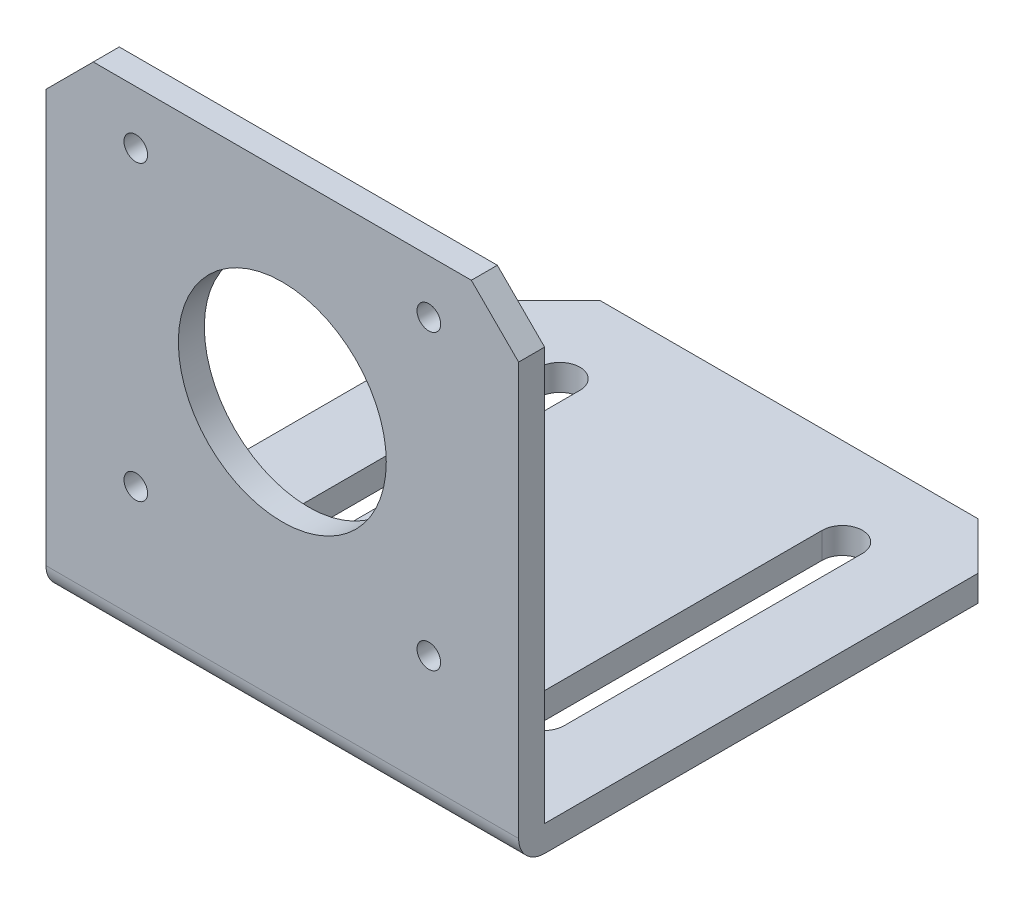
ISO-10303-21;
HEADER;
FILE_DESCRIPTION(('STEP AP214'),'2;1');
FILE_NAME('part.step','',(''),(''),'','','');
FILE_SCHEMA(('AUTOMOTIVE_DESIGN { 1 0 10303 214 1 1 1 1 }'));
ENDSEC;
DATA;
#1=APPLICATION_CONTEXT('core data for automotive mechanical design processes');
#2=APPLICATION_PROTOCOL_DEFINITION('international standard','automotive_design',2000,#1);
#3=PRODUCT_CONTEXT('',#1,'mechanical');
#4=PRODUCT('Part','Part','',(#3));
#5=PRODUCT_RELATED_PRODUCT_CATEGORY('part','',(#4));
#6=PRODUCT_DEFINITION_FORMATION('','',#4);
#7=PRODUCT_DEFINITION_CONTEXT('part definition',#1,'design');
#8=PRODUCT_DEFINITION('design','',#6,#7);
#9=PRODUCT_DEFINITION_SHAPE('','',#8);
#10=(LENGTH_UNIT() NAMED_UNIT(*) SI_UNIT(.MILLI.,.METRE.));
#11=(NAMED_UNIT(*) PLANE_ANGLE_UNIT() SI_UNIT($,.RADIAN.));
#12=(NAMED_UNIT(*) SI_UNIT($,.STERADIAN.) SOLID_ANGLE_UNIT());
#13=UNCERTAINTY_MEASURE_WITH_UNIT(LENGTH_MEASURE(1.E-05),#10,'distance_accuracy_value','');
#14=(GEOMETRIC_REPRESENTATION_CONTEXT(3) GLOBAL_UNCERTAINTY_ASSIGNED_CONTEXT((#13)) GLOBAL_UNIT_ASSIGNED_CONTEXT((#10,
#11,#12)) REPRESENTATION_CONTEXT('',''));
#15=CARTESIAN_POINT('',(0.,0.,0.));
#16=DIRECTION('',(0.,0.,1.));
#17=DIRECTION('',(1.,0.,0.));
#18=AXIS2_PLACEMENT_3D('',#15,#16,#17);
#19=CARTESIAN_POINT('',(25.,21.15,0.));
#20=DIRECTION('',(0.,-1.,0.));
#21=DIRECTION('',(0.,0.,-1.));
#22=AXIS2_PLACEMENT_3D('',#19,#20,#21);
#23=PLANE('',#22);
#24=DIRECTION('',(-1.,0.,0.));
#25=VECTOR('',#24,1.);
#26=CARTESIAN_POINT('',(25.,21.15,2.75));
#27=LINE('',#26,#25);
#28=CARTESIAN_POINT('',(20.,21.15,2.75));
#29=VERTEX_POINT('',#28);
#30=CARTESIAN_POINT('',(-20.,21.15,2.75));
#31=VERTEX_POINT('',#30);
#32=EDGE_CURVE('E276',#29,#31,#27,.T.);
#33=ORIENTED_EDGE('',*,*,#32,.F.);
#34=DIRECTION('',(0.,0.,-1.));
#35=VECTOR('',#34,1.);
#36=CARTESIAN_POINT('',(20.,21.15,0.));
#37=LINE('',#36,#35);
#38=CARTESIAN_POINT('',(20.,21.15,0.));
#39=VERTEX_POINT('',#38);
#40=EDGE_CURVE('E54',#29,#39,#37,.T.);
#41=ORIENTED_EDGE('',*,*,#40,.T.);
#42=DIRECTION('',(-1.,0.,0.));
#43=VECTOR('',#42,1.);
#44=CARTESIAN_POINT('',(25.,21.15,0.));
#45=LINE('',#44,#43);
#46=CARTESIAN_POINT('',(-20.,21.15,0.));
#47=VERTEX_POINT('',#46);
#48=EDGE_CURVE('E248',#39,#47,#45,.T.);
#49=ORIENTED_EDGE('',*,*,#48,.T.);
#50=DIRECTION('',(0.,0.,1.));
#51=VECTOR('',#50,1.);
#52=CARTESIAN_POINT('',(-20.,21.15,0.));
#53=LINE('',#52,#51);
#54=EDGE_CURVE('E340',#47,#31,#53,.T.);
#55=ORIENTED_EDGE('',*,*,#54,.T.);
#56=EDGE_LOOP('',(#33,#41,#49,#55));
#57=FACE_BOUND('',#56,.T.);
#58=ADVANCED_FACE('F33',(#57),#23,.F.);
#59=CARTESIAN_POINT('',(25.,21.15,2.75));
#60=DIRECTION('',(0.,0.,-1.));
#61=DIRECTION('',(0.,1.,0.));
#62=AXIS2_PLACEMENT_3D('',#59,#60,#61);
#63=PLANE('',#62);
#64=CARTESIAN_POINT('',(0.,0.,2.75));
#65=DIRECTION('',(0.,0.,1.));
#66=DIRECTION('',(1.,0.,0.));
#67=AXIS2_PLACEMENT_3D('',#64,#65,#66);
#68=CIRCLE('',#67,11.);
#69=CARTESIAN_POINT('',(11.,0.,2.75));
#70=VERTEX_POINT('',#69);
#71=EDGE_CURVE('E197',#70,#70,#68,.T.);
#72=ORIENTED_EDGE('',*,*,#71,.F.);
#73=EDGE_LOOP('',(#72));
#74=FACE_BOUND('',#73,.T.);
#75=CARTESIAN_POINT('',(15.5,-15.5,2.75));
#76=DIRECTION('',(0.,0.,1.));
#77=DIRECTION('',(1.,0.,0.));
#78=AXIS2_PLACEMENT_3D('',#75,#76,#77);
#79=CIRCLE('',#78,1.25);
#80=CARTESIAN_POINT('',(16.75,-15.5,2.75));
#81=VERTEX_POINT('',#80);
#82=EDGE_CURVE('E227',#81,#81,#79,.T.);
#83=ORIENTED_EDGE('',*,*,#82,.F.);
#84=EDGE_LOOP('',(#83));
#85=FACE_BOUND('',#84,.T.);
#86=CARTESIAN_POINT('',(15.5,15.5,2.75));
#87=DIRECTION('',(0.,0.,1.));
#88=DIRECTION('',(1.,0.,0.));
#89=AXIS2_PLACEMENT_3D('',#86,#87,#88);
#90=CIRCLE('',#89,1.25);
#91=CARTESIAN_POINT('',(16.75,15.5,2.75));
#92=VERTEX_POINT('',#91);
#93=EDGE_CURVE('E224',#92,#92,#90,.T.);
#94=ORIENTED_EDGE('',*,*,#93,.F.);
#95=EDGE_LOOP('',(#94));
#96=FACE_BOUND('',#95,.T.);
#97=CARTESIAN_POINT('',(-15.5,15.5,2.75));
#98=DIRECTION('',(0.,0.,1.));
#99=DIRECTION('',(1.,0.,0.));
#100=AXIS2_PLACEMENT_3D('',#97,#98,#99);
#101=CIRCLE('',#100,1.25);
#102=CARTESIAN_POINT('',(-14.25,15.5,2.75));
#103=VERTEX_POINT('',#102);
#104=EDGE_CURVE('E220',#103,#103,#101,.T.);
#105=ORIENTED_EDGE('',*,*,#104,.F.);
#106=EDGE_LOOP('',(#105));
#107=FACE_BOUND('',#106,.T.);
#108=CARTESIAN_POINT('',(-15.5,-15.5,2.75));
#109=DIRECTION('',(0.,0.,1.));
#110=DIRECTION('',(1.,0.,0.));
#111=AXIS2_PLACEMENT_3D('',#108,#109,#110);
#112=CIRCLE('',#111,1.25);
#113=CARTESIAN_POINT('',(-14.25,-15.5,2.75));
#114=VERTEX_POINT('',#113);
#115=EDGE_CURVE('E223',#114,#114,#112,.T.);
#116=ORIENTED_EDGE('',*,*,#115,.F.);
#117=EDGE_LOOP('',(#116));
#118=FACE_BOUND('',#117,.T.);
#119=DIRECTION('',(0.,-1.,0.));
#120=VECTOR('',#119,1.);
#121=CARTESIAN_POINT('',(25.,21.15,2.75));
#122=LINE('',#121,#120);
#123=CARTESIAN_POINT('',(25.,16.15,2.75));
#124=VERTEX_POINT('',#123);
#125=CARTESIAN_POINT('',(25.,-27.5,2.75));
#126=VERTEX_POINT('',#125);
#127=EDGE_CURVE('E235',#124,#126,#122,.T.);
#128=ORIENTED_EDGE('',*,*,#127,.F.);
#129=DIRECTION('',(-0.707106781186549,0.707106781186547,0.));
#130=VECTOR('',#129,1.);
#131=CARTESIAN_POINT('',(25.,16.15,2.75));
#132=LINE('',#131,#130);
#133=EDGE_CURVE('E338',#124,#29,#132,.T.);
#134=ORIENTED_EDGE('',*,*,#133,.T.);
#135=ORIENTED_EDGE('',*,*,#32,.T.);
#136=DIRECTION('',(0.707106781186547,0.707106781186549,0.));
#137=VECTOR('',#136,1.);
#138=CARTESIAN_POINT('',(-20.,21.15,2.75));
#139=LINE('',#138,#137);
#140=CARTESIAN_POINT('',(-25.,16.15,2.75));
#141=VERTEX_POINT('',#140);
#142=EDGE_CURVE('E336',#31,#141,#139,.F.);
#143=ORIENTED_EDGE('',*,*,#142,.T.);
#144=DIRECTION('',(0.,-1.,0.));
#145=VECTOR('',#144,1.);
#146=CARTESIAN_POINT('',(-25.,21.15,2.75));
#147=LINE('',#146,#145);
#148=CARTESIAN_POINT('',(-25.,-27.5,2.75));
#149=VERTEX_POINT('',#148);
#150=EDGE_CURVE('E249',#141,#149,#147,.T.);
#151=ORIENTED_EDGE('',*,*,#150,.T.);
#152=DIRECTION('',(-1.,0.,0.));
#153=VECTOR('',#152,1.);
#154=CARTESIAN_POINT('',(25.,-27.5,2.75));
#155=LINE('',#154,#153);
#156=EDGE_CURVE('E273',#126,#149,#155,.T.);
#157=ORIENTED_EDGE('',*,*,#156,.F.);
#158=EDGE_LOOP('',(#128,#134,#135,#143,#151,#157));
#159=FACE_BOUND('',#158,.T.);
#160=ADVANCED_FACE('F347',(#74,#85,#96,#107,#118,#159),#63,.F.);
#161=CARTESIAN_POINT('',(25.,-27.5,0.));
#162=DIRECTION('',(-1.,0.,0.));
#163=DIRECTION('',(0.,0.,1.));
#164=AXIS2_PLACEMENT_3D('',#161,#162,#163);
#165=CYLINDRICAL_SURFACE('',#164,2.75);
#166=CARTESIAN_POINT('',(-25.,-27.5,0.));
#167=DIRECTION('',(1.,0.,0.));
#168=DIRECTION('',(0.,0.,-1.));
#169=AXIS2_PLACEMENT_3D('',#166,#167,#168);
#170=CIRCLE('',#169,2.75);
#171=CARTESIAN_POINT('',(-25.,-30.25,0.));
#172=VERTEX_POINT('',#171);
#173=EDGE_CURVE('E251',#149,#172,#170,.T.);
#174=ORIENTED_EDGE('',*,*,#173,.T.);
#175=DIRECTION('',(-1.,0.,0.));
#176=VECTOR('',#175,1.);
#177=CARTESIAN_POINT('',(25.,-30.25,0.));
#178=LINE('',#177,#176);
#179=CARTESIAN_POINT('',(25.,-30.25,0.));
#180=VERTEX_POINT('',#179);
#181=EDGE_CURVE('E270',#180,#172,#178,.T.);
#182=ORIENTED_EDGE('',*,*,#181,.F.);
#183=CARTESIAN_POINT('',(25.,-27.5,0.));
#184=DIRECTION('',(1.,0.,0.));
#185=DIRECTION('',(0.,0.,-1.));
#186=AXIS2_PLACEMENT_3D('',#183,#184,#185);
#187=CIRCLE('',#186,2.75);
#188=EDGE_CURVE('E237',#126,#180,#187,.T.);
#189=ORIENTED_EDGE('',*,*,#188,.F.);
#190=ORIENTED_EDGE('',*,*,#156,.T.);
#191=EDGE_LOOP('',(#174,#182,#189,#190));
#192=FACE_BOUND('',#191,.T.);
#193=ADVANCED_FACE('F378',(#192),#165,.T.);
#194=CARTESIAN_POINT('',(25.,-30.25,0.));
#195=DIRECTION('',(0.,1.,0.));
#196=DIRECTION('',(0.,0.,1.));
#197=AXIS2_PLACEMENT_3D('',#194,#195,#196);
#198=PLANE('',#197);
#199=DIRECTION('',(0.,0.,-1.));
#200=VECTOR('',#199,1.);
#201=CARTESIAN_POINT('',(-17.07,-30.25,-9.995));
#202=LINE('',#201,#200);
#203=CARTESIAN_POINT('',(-17.07,-30.25,-9.99499999999999));
#204=VERTEX_POINT('',#203);
#205=CARTESIAN_POINT('',(-17.07,-30.25,-41.55));
#206=VERTEX_POINT('',#205);
#207=EDGE_CURVE('E180',#204,#206,#202,.T.);
#208=ORIENTED_EDGE('',*,*,#207,.F.);
#209=CARTESIAN_POINT('',(-14.945,-30.25,-9.995));
#210=DIRECTION('',(0.,-1.,0.));
#211=DIRECTION('',(0.,0.,-1.));
#212=AXIS2_PLACEMENT_3D('',#209,#210,#211);
#213=CIRCLE('',#212,2.125);
#214=CARTESIAN_POINT('',(-12.82,-30.25,-9.995));
#215=VERTEX_POINT('',#214);
#216=EDGE_CURVE('E185',#215,#204,#213,.T.);
#217=ORIENTED_EDGE('',*,*,#216,.F.);
#218=DIRECTION('',(0.,0.,1.));
#219=VECTOR('',#218,1.);
#220=CARTESIAN_POINT('',(-12.82,-30.25,-9.995));
#221=LINE('',#220,#219);
#222=CARTESIAN_POINT('',(-12.82,-30.25,-41.55));
#223=VERTEX_POINT('',#222);
#224=EDGE_CURVE('E190',#223,#215,#221,.T.);
#225=ORIENTED_EDGE('',*,*,#224,.F.);
#226=CARTESIAN_POINT('',(-14.945,-30.25,-41.55));
#227=DIRECTION('',(0.,-1.,0.));
#228=DIRECTION('',(0.,0.,-1.));
#229=AXIS2_PLACEMENT_3D('',#226,#227,#228);
#230=CIRCLE('',#229,2.125);
#231=EDGE_CURVE('E169',#206,#223,#230,.T.);
#232=ORIENTED_EDGE('',*,*,#231,.F.);
#233=EDGE_LOOP('',(#208,#217,#225,#232));
#234=FACE_BOUND('',#233,.T.);
#235=DIRECTION('',(0.,0.,-1.));
#236=VECTOR('',#235,1.);
#237=CARTESIAN_POINT('',(12.82,-30.25,-9.995));
#238=LINE('',#237,#236);
#239=CARTESIAN_POINT('',(12.82,-30.25,-9.99499999999999));
#240=VERTEX_POINT('',#239);
#241=CARTESIAN_POINT('',(12.82,-30.25,-41.55));
#242=VERTEX_POINT('',#241);
#243=EDGE_CURVE('E202',#240,#242,#238,.T.);
#244=ORIENTED_EDGE('',*,*,#243,.F.);
#245=CARTESIAN_POINT('',(14.945,-30.25,-9.995));
#246=DIRECTION('',(0.,-1.,0.));
#247=DIRECTION('',(0.,0.,1.));
#248=AXIS2_PLACEMENT_3D('',#245,#246,#247);
#249=CIRCLE('',#248,2.125);
#250=CARTESIAN_POINT('',(17.07,-30.25,-9.995));
#251=VERTEX_POINT('',#250);
#252=EDGE_CURVE('E200',#251,#240,#249,.T.);
#253=ORIENTED_EDGE('',*,*,#252,.F.);
#254=DIRECTION('',(0.,0.,1.));
#255=VECTOR('',#254,1.);
#256=CARTESIAN_POINT('',(17.07,-30.25,-9.995));
#257=LINE('',#256,#255);
#258=CARTESIAN_POINT('',(17.07,-30.25,-41.55));
#259=VERTEX_POINT('',#258);
#260=EDGE_CURVE('E208',#259,#251,#257,.T.);
#261=ORIENTED_EDGE('',*,*,#260,.F.);
#262=CARTESIAN_POINT('',(14.945,-30.25,-41.55));
#263=DIRECTION('',(0.,-1.,0.));
#264=DIRECTION('',(0.,0.,1.));
#265=AXIS2_PLACEMENT_3D('',#262,#263,#264);
#266=CIRCLE('',#265,2.125);
#267=EDGE_CURVE('E205',#242,#259,#266,.T.);
#268=ORIENTED_EDGE('',*,*,#267,.F.);
#269=EDGE_LOOP('',(#244,#253,#261,#268));
#270=FACE_BOUND('',#269,.T.);
#271=DIRECTION('',(-1.,0.,0.));
#272=VECTOR('',#271,1.);
#273=CARTESIAN_POINT('',(25.,-30.25,-50.85));
#274=LINE('',#273,#272);
#275=CARTESIAN_POINT('',(20.,-30.25,-50.85));
#276=VERTEX_POINT('',#275);
#277=CARTESIAN_POINT('',(-20.,-30.25,-50.85));
#278=VERTEX_POINT('',#277);
#279=EDGE_CURVE('E267',#276,#278,#274,.T.);
#280=ORIENTED_EDGE('',*,*,#279,.F.);
#281=DIRECTION('',(0.707106781186549,0.,0.707106781186545));
#282=VECTOR('',#281,1.);
#283=CARTESIAN_POINT('',(25.,-30.25,-45.85));
#284=LINE('',#283,#282);
#285=CARTESIAN_POINT('',(25.,-30.25,-45.85));
#286=VERTEX_POINT('',#285);
#287=EDGE_CURVE('E330',#276,#286,#284,.T.);
#288=ORIENTED_EDGE('',*,*,#287,.T.);
#289=DIRECTION('',(0.,0.,-1.));
#290=VECTOR('',#289,1.);
#291=CARTESIAN_POINT('',(25.,-30.25,0.));
#292=LINE('',#291,#290);
#293=EDGE_CURVE('E240',#180,#286,#292,.T.);
#294=ORIENTED_EDGE('',*,*,#293,.F.);
#295=ORIENTED_EDGE('',*,*,#181,.T.);
#296=DIRECTION('',(0.,0.,-1.));
#297=VECTOR('',#296,1.);
#298=CARTESIAN_POINT('',(-25.,-30.25,0.));
#299=LINE('',#298,#297);
#300=CARTESIAN_POINT('',(-25.,-30.25,-45.85));
#301=VERTEX_POINT('',#300);
#302=EDGE_CURVE('E254',#172,#301,#299,.T.);
#303=ORIENTED_EDGE('',*,*,#302,.T.);
#304=DIRECTION('',(-0.707106781186546,0.,0.707106781186548));
#305=VECTOR('',#304,1.);
#306=CARTESIAN_POINT('',(-20.,-30.25,-50.85));
#307=LINE('',#306,#305);
#308=EDGE_CURVE('E328',#301,#278,#307,.F.);
#309=ORIENTED_EDGE('',*,*,#308,.T.);
#310=EDGE_LOOP('',(#280,#288,#294,#295,#303,#309));
#311=FACE_BOUND('',#310,.T.);
#312=ADVANCED_FACE('F187',(#234,#270,#311),#198,.F.);
#313=CARTESIAN_POINT('',(25.,-27.5,-50.85));
#314=DIRECTION('',(0.,0.,1.));
#315=DIRECTION('',(1.,0.,0.));
#316=AXIS2_PLACEMENT_3D('',#313,#314,#315);
#317=PLANE('',#316);
#318=DIRECTION('',(-1.,0.,0.));
#319=VECTOR('',#318,1.);
#320=CARTESIAN_POINT('',(25.,-27.5,-50.85));
#321=LINE('',#320,#319);
#322=CARTESIAN_POINT('',(20.,-27.5,-50.85));
#323=VERTEX_POINT('',#322);
#324=CARTESIAN_POINT('',(-20.,-27.5,-50.85));
#325=VERTEX_POINT('',#324);
#326=EDGE_CURVE('E264',#323,#325,#321,.T.);
#327=ORIENTED_EDGE('',*,*,#326,.F.);
#328=DIRECTION('',(0.,-1.,0.));
#329=VECTOR('',#328,1.);
#330=CARTESIAN_POINT('',(20.,-30.25,-50.85));
#331=LINE('',#330,#329);
#332=EDGE_CURVE('E326',#323,#276,#331,.T.);
#333=ORIENTED_EDGE('',*,*,#332,.T.);
#334=ORIENTED_EDGE('',*,*,#279,.T.);
#335=DIRECTION('',(0.,1.,0.));
#336=VECTOR('',#335,1.);
#337=CARTESIAN_POINT('',(-20.,-27.5,-50.85));
#338=LINE('',#337,#336);
#339=EDGE_CURVE('E323',#278,#325,#338,.T.);
#340=ORIENTED_EDGE('',*,*,#339,.T.);
#341=EDGE_LOOP('',(#327,#333,#334,#340));
#342=FACE_BOUND('',#341,.T.);
#343=ADVANCED_FACE('F399',(#342),#317,.F.);
#344=CARTESIAN_POINT('',(25.,-27.5,0.));
#345=DIRECTION('',(0.,-1.,0.));
#346=DIRECTION('',(0.,0.,-1.));
#347=AXIS2_PLACEMENT_3D('',#344,#345,#346);
#348=PLANE('',#347);
#349=DIRECTION('',(0.,0.,1.));
#350=VECTOR('',#349,1.);
#351=CARTESIAN_POINT('',(-12.82,-27.5,0.));
#352=LINE('',#351,#350);
#353=CARTESIAN_POINT('',(-12.82,-27.5,-41.55));
#354=VERTEX_POINT('',#353);
#355=CARTESIAN_POINT('',(-12.82,-27.5,-9.995));
#356=VERTEX_POINT('',#355);
#357=EDGE_CURVE('E307',#354,#356,#352,.T.);
#358=ORIENTED_EDGE('',*,*,#357,.T.);
#359=CARTESIAN_POINT('',(-14.945,-27.5,-9.995));
#360=DIRECTION('',(0.,-1.,0.));
#361=DIRECTION('',(0.,0.,-1.));
#362=AXIS2_PLACEMENT_3D('',#359,#360,#361);
#363=CIRCLE('',#362,2.125);
#364=CARTESIAN_POINT('',(-17.07,-27.5,-9.995));
#365=VERTEX_POINT('',#364);
#366=EDGE_CURVE('E310',#356,#365,#363,.T.);
#367=ORIENTED_EDGE('',*,*,#366,.T.);
#368=DIRECTION('',(0.,0.,-1.));
#369=VECTOR('',#368,1.);
#370=CARTESIAN_POINT('',(-17.07,-27.5,0.));
#371=LINE('',#370,#369);
#372=CARTESIAN_POINT('',(-17.07,-27.5,-41.55));
#373=VERTEX_POINT('',#372);
#374=EDGE_CURVE('E304',#365,#373,#371,.T.);
#375=ORIENTED_EDGE('',*,*,#374,.T.);
#376=CARTESIAN_POINT('',(-14.945,-27.5,-41.55));
#377=DIRECTION('',(0.,-1.,0.));
#378=DIRECTION('',(0.,0.,-1.));
#379=AXIS2_PLACEMENT_3D('',#376,#377,#378);
#380=CIRCLE('',#379,2.125);
#381=EDGE_CURVE('E172',#373,#354,#380,.T.);
#382=ORIENTED_EDGE('',*,*,#381,.T.);
#383=EDGE_LOOP('',(#358,#367,#375,#382));
#384=FACE_BOUND('',#383,.T.);
#385=DIRECTION('',(0.,0.,1.));
#386=VECTOR('',#385,1.);
#387=CARTESIAN_POINT('',(17.07,-27.5,0.));
#388=LINE('',#387,#386);
#389=CARTESIAN_POINT('',(17.07,-27.5,-41.55));
#390=VERTEX_POINT('',#389);
#391=CARTESIAN_POINT('',(17.07,-27.5,-9.995));
#392=VERTEX_POINT('',#391);
#393=EDGE_CURVE('E298',#390,#392,#388,.T.);
#394=ORIENTED_EDGE('',*,*,#393,.T.);
#395=CARTESIAN_POINT('',(14.945,-27.5,-9.995));
#396=DIRECTION('',(0.,-1.,0.));
#397=DIRECTION('',(0.,0.,-1.));
#398=AXIS2_PLACEMENT_3D('',#395,#396,#397);
#399=CIRCLE('',#398,2.125);
#400=CARTESIAN_POINT('',(12.82,-27.5,-9.995));
#401=VERTEX_POINT('',#400);
#402=EDGE_CURVE('E301',#392,#401,#399,.T.);
#403=ORIENTED_EDGE('',*,*,#402,.T.);
#404=DIRECTION('',(0.,0.,-1.));
#405=VECTOR('',#404,1.);
#406=CARTESIAN_POINT('',(12.82,-27.5,0.));
#407=LINE('',#406,#405);
#408=CARTESIAN_POINT('',(12.82,-27.5,-41.55));
#409=VERTEX_POINT('',#408);
#410=EDGE_CURVE('E279',#401,#409,#407,.T.);
#411=ORIENTED_EDGE('',*,*,#410,.T.);
#412=CARTESIAN_POINT('',(14.945,-27.5,-41.55));
#413=DIRECTION('',(0.,-1.,0.));
#414=DIRECTION('',(0.,0.,-1.));
#415=AXIS2_PLACEMENT_3D('',#412,#413,#414);
#416=CIRCLE('',#415,2.125);
#417=EDGE_CURVE('E295',#409,#390,#416,.T.);
#418=ORIENTED_EDGE('',*,*,#417,.T.);
#419=EDGE_LOOP('',(#394,#403,#411,#418));
#420=FACE_BOUND('',#419,.T.);
#421=DIRECTION('',(0.,0.,1.));
#422=VECTOR('',#421,1.);
#423=CARTESIAN_POINT('',(25.,-27.5,0.));
#424=LINE('',#423,#422);
#425=CARTESIAN_POINT('',(25.,-27.5,-45.85));
#426=VERTEX_POINT('',#425);
#427=CARTESIAN_POINT('',(25.,-27.5,0.));
#428=VERTEX_POINT('',#427);
#429=EDGE_CURVE('E243',#426,#428,#424,.T.);
#430=ORIENTED_EDGE('',*,*,#429,.F.);
#431=DIRECTION('',(-0.707106781186549,0.,-0.707106781186545));
#432=VECTOR('',#431,1.);
#433=CARTESIAN_POINT('',(25.,-27.5,-45.85));
#434=LINE('',#433,#432);
#435=EDGE_CURVE('E321',#426,#323,#434,.T.);
#436=ORIENTED_EDGE('',*,*,#435,.T.);
#437=ORIENTED_EDGE('',*,*,#326,.T.);
#438=DIRECTION('',(0.707106781186546,0.,-0.707106781186548));
#439=VECTOR('',#438,1.);
#440=CARTESIAN_POINT('',(-20.,-27.5,-50.85));
#441=LINE('',#440,#439);
#442=CARTESIAN_POINT('',(-25.,-27.5,-45.85));
#443=VERTEX_POINT('',#442);
#444=EDGE_CURVE('E319',#325,#443,#441,.F.);
#445=ORIENTED_EDGE('',*,*,#444,.T.);
#446=DIRECTION('',(0.,0.,1.));
#447=VECTOR('',#446,1.);
#448=CARTESIAN_POINT('',(-25.,-27.5,0.));
#449=LINE('',#448,#447);
#450=CARTESIAN_POINT('',(-25.,-27.5,0.));
#451=VERTEX_POINT('',#450);
#452=EDGE_CURVE('E257',#443,#451,#449,.T.);
#453=ORIENTED_EDGE('',*,*,#452,.T.);
#454=DIRECTION('',(-1.,0.,0.));
#455=VECTOR('',#454,1.);
#456=CARTESIAN_POINT('',(25.,-27.5,0.));
#457=LINE('',#456,#455);
#458=EDGE_CURVE('E261',#428,#451,#457,.T.);
#459=ORIENTED_EDGE('',*,*,#458,.F.);
#460=EDGE_LOOP('',(#430,#436,#437,#445,#453,#459));
#461=FACE_BOUND('',#460,.T.);
#462=ADVANCED_FACE('F414',(#384,#420,#461),#348,.F.);
#463=CARTESIAN_POINT('',(25.,21.15,0.));
#464=DIRECTION('',(0.,0.,1.));
#465=DIRECTION('',(0.,-1.,0.));
#466=AXIS2_PLACEMENT_3D('',#463,#464,#465);
#467=PLANE('',#466);
#468=CARTESIAN_POINT('',(0.,0.,0.));
#469=DIRECTION('',(0.,0.,1.));
#470=DIRECTION('',(0.,-1.,0.));
#471=AXIS2_PLACEMENT_3D('',#468,#469,#470);
#472=CIRCLE('',#471,11.);
#473=CARTESIAN_POINT('',(0.,-11.,0.));
#474=VERTEX_POINT('',#473);
#475=EDGE_CURVE('E252',#474,#474,#472,.T.);
#476=ORIENTED_EDGE('',*,*,#475,.T.);
#477=EDGE_LOOP('',(#476));
#478=FACE_BOUND('',#477,.T.);
#479=CARTESIAN_POINT('',(15.5,-15.5,0.));
#480=DIRECTION('',(0.,0.,1.));
#481=DIRECTION('',(0.,-1.,0.));
#482=AXIS2_PLACEMENT_3D('',#479,#480,#481);
#483=CIRCLE('',#482,1.25);
#484=CARTESIAN_POINT('',(15.5,-16.75,0.));
#485=VERTEX_POINT('',#484);
#486=EDGE_CURVE('E288',#485,#485,#483,.T.);
#487=ORIENTED_EDGE('',*,*,#486,.T.);
#488=EDGE_LOOP('',(#487));
#489=FACE_BOUND('',#488,.T.);
#490=CARTESIAN_POINT('',(15.5,15.5,0.));
#491=DIRECTION('',(0.,0.,1.));
#492=DIRECTION('',(0.,-1.,0.));
#493=AXIS2_PLACEMENT_3D('',#490,#491,#492);
#494=CIRCLE('',#493,1.25);
#495=CARTESIAN_POINT('',(15.5,14.25,0.));
#496=VERTEX_POINT('',#495);
#497=EDGE_CURVE('E285',#496,#496,#494,.T.);
#498=ORIENTED_EDGE('',*,*,#497,.T.);
#499=EDGE_LOOP('',(#498));
#500=FACE_BOUND('',#499,.T.);
#501=CARTESIAN_POINT('',(-15.5,15.5,0.));
#502=DIRECTION('',(0.,0.,1.));
#503=DIRECTION('',(0.,-1.,0.));
#504=AXIS2_PLACEMENT_3D('',#501,#502,#503);
#505=CIRCLE('',#504,1.25);
#506=CARTESIAN_POINT('',(-15.5,14.25,0.));
#507=VERTEX_POINT('',#506);
#508=EDGE_CURVE('E282',#507,#507,#505,.T.);
#509=ORIENTED_EDGE('',*,*,#508,.T.);
#510=EDGE_LOOP('',(#509));
#511=FACE_BOUND('',#510,.T.);
#512=CARTESIAN_POINT('',(-15.5,-15.5,0.));
#513=DIRECTION('',(0.,0.,1.));
#514=DIRECTION('',(0.,-1.,0.));
#515=AXIS2_PLACEMENT_3D('',#512,#513,#514);
#516=CIRCLE('',#515,1.25);
#517=CARTESIAN_POINT('',(-15.5,-16.75,0.));
#518=VERTEX_POINT('',#517);
#519=EDGE_CURVE('E234',#518,#518,#516,.T.);
#520=ORIENTED_EDGE('',*,*,#519,.T.);
#521=EDGE_LOOP('',(#520));
#522=FACE_BOUND('',#521,.T.);
#523=ORIENTED_EDGE('',*,*,#48,.F.);
#524=DIRECTION('',(0.707106781186549,-0.707106781186547,0.));
#525=VECTOR('',#524,1.);
#526=CARTESIAN_POINT('',(25.,16.15,0.));
#527=LINE('',#526,#525);
#528=CARTESIAN_POINT('',(25.,16.15,0.));
#529=VERTEX_POINT('',#528);
#530=EDGE_CURVE('E11',#39,#529,#527,.T.);
#531=ORIENTED_EDGE('',*,*,#530,.T.);
#532=DIRECTION('',(0.,1.,0.));
#533=VECTOR('',#532,1.);
#534=CARTESIAN_POINT('',(25.,21.15,0.));
#535=LINE('',#534,#533);
#536=EDGE_CURVE('E245',#428,#529,#535,.T.);
#537=ORIENTED_EDGE('',*,*,#536,.F.);
#538=ORIENTED_EDGE('',*,*,#458,.T.);
#539=DIRECTION('',(0.,1.,0.));
#540=VECTOR('',#539,1.);
#541=CARTESIAN_POINT('',(-25.,21.15,0.));
#542=LINE('',#541,#540);
#543=CARTESIAN_POINT('',(-25.,16.15,0.));
#544=VERTEX_POINT('',#543);
#545=EDGE_CURVE('E238',#451,#544,#542,.T.);
#546=ORIENTED_EDGE('',*,*,#545,.T.);
#547=DIRECTION('',(-0.707106781186547,-0.707106781186549,0.));
#548=VECTOR('',#547,1.);
#549=CARTESIAN_POINT('',(-20.,21.15,0.));
#550=LINE('',#549,#548);
#551=EDGE_CURVE('E41',#544,#47,#550,.F.);
#552=ORIENTED_EDGE('',*,*,#551,.T.);
#553=EDGE_LOOP('',(#523,#531,#537,#538,#546,#552));
#554=FACE_BOUND('',#553,.T.);
#555=ADVANCED_FACE('F359',(#478,#489,#500,#511,#522,#554),#467,.F.);
#556=CARTESIAN_POINT('',(25.,-27.5,0.));
#557=DIRECTION('',(1.,0.,0.));
#558=DIRECTION('',(0.,0.,-1.));
#559=AXIS2_PLACEMENT_3D('',#556,#557,#558);
#560=PLANE('',#559);
#561=ORIENTED_EDGE('',*,*,#293,.T.);
#562=DIRECTION('',(0.,1.,0.));
#563=VECTOR('',#562,1.);
#564=CARTESIAN_POINT('',(25.,-27.5,-45.85));
#565=LINE('',#564,#563);
#566=EDGE_CURVE('E316',#286,#426,#565,.T.);
#567=ORIENTED_EDGE('',*,*,#566,.T.);
#568=ORIENTED_EDGE('',*,*,#429,.T.);
#569=ORIENTED_EDGE('',*,*,#536,.T.);
#570=DIRECTION('',(0.,0.,1.));
#571=VECTOR('',#570,1.);
#572=CARTESIAN_POINT('',(25.,16.15,2.75));
#573=LINE('',#572,#571);
#574=EDGE_CURVE('E313',#529,#124,#573,.T.);
#575=ORIENTED_EDGE('',*,*,#574,.T.);
#576=ORIENTED_EDGE('',*,*,#127,.T.);
#577=ORIENTED_EDGE('',*,*,#188,.T.);
#578=EDGE_LOOP('',(#561,#567,#568,#569,#575,#576,#577));
#579=FACE_BOUND('',#578,.T.);
#580=ADVANCED_FACE('F355',(#579),#560,.T.);
#581=CARTESIAN_POINT('',(-25.,-27.5,0.));
#582=DIRECTION('',(1.,0.,0.));
#583=DIRECTION('',(0.,0.,-1.));
#584=AXIS2_PLACEMENT_3D('',#581,#582,#583);
#585=PLANE('',#584);
#586=ORIENTED_EDGE('',*,*,#452,.F.);
#587=DIRECTION('',(0.,-1.,0.));
#588=VECTOR('',#587,1.);
#589=CARTESIAN_POINT('',(-25.,-27.5,-45.85));
#590=LINE('',#589,#588);
#591=EDGE_CURVE('E334',#443,#301,#590,.T.);
#592=ORIENTED_EDGE('',*,*,#591,.T.);
#593=ORIENTED_EDGE('',*,*,#302,.F.);
#594=ORIENTED_EDGE('',*,*,#173,.F.);
#595=ORIENTED_EDGE('',*,*,#150,.F.);
#596=DIRECTION('',(0.,0.,-1.));
#597=VECTOR('',#596,1.);
#598=CARTESIAN_POINT('',(-25.,16.15,0.));
#599=LINE('',#598,#597);
#600=EDGE_CURVE('E332',#141,#544,#599,.T.);
#601=ORIENTED_EDGE('',*,*,#600,.T.);
#602=ORIENTED_EDGE('',*,*,#545,.F.);
#603=EDGE_LOOP('',(#586,#592,#593,#594,#595,#601,#602));
#604=FACE_BOUND('',#603,.T.);
#605=ADVANCED_FACE('F364',(#604),#585,.F.);
#606=CARTESIAN_POINT('',(-15.5,-15.5,-50.85));
#607=DIRECTION('',(0.,0.,1.));
#608=DIRECTION('',(1.,0.,0.));
#609=AXIS2_PLACEMENT_3D('',#606,#607,#608);
#610=CYLINDRICAL_SURFACE('',#609,1.25);
#611=ORIENTED_EDGE('',*,*,#115,.T.);
#612=EDGE_LOOP('',(#611));
#613=FACE_BOUND('',#612,.T.);
#614=ORIENTED_EDGE('',*,*,#519,.F.);
#615=EDGE_LOOP('',(#614));
#616=FACE_BOUND('',#615,.T.);
#617=ADVANCED_FACE('F423',(#613,#616),#610,.F.);
#618=CARTESIAN_POINT('',(-15.5,15.5,-50.85));
#619=DIRECTION('',(0.,0.,1.));
#620=DIRECTION('',(1.,0.,0.));
#621=AXIS2_PLACEMENT_3D('',#618,#619,#620);
#622=CYLINDRICAL_SURFACE('',#621,1.25);
#623=ORIENTED_EDGE('',*,*,#104,.T.);
#624=EDGE_LOOP('',(#623));
#625=FACE_BOUND('',#624,.T.);
#626=ORIENTED_EDGE('',*,*,#508,.F.);
#627=EDGE_LOOP('',(#626));
#628=FACE_BOUND('',#627,.T.);
#629=ADVANCED_FACE('F428',(#625,#628),#622,.F.);
#630=CARTESIAN_POINT('',(15.5,15.5,-50.85));
#631=DIRECTION('',(0.,0.,1.));
#632=DIRECTION('',(1.,0.,0.));
#633=AXIS2_PLACEMENT_3D('',#630,#631,#632);
#634=CYLINDRICAL_SURFACE('',#633,1.25);
#635=ORIENTED_EDGE('',*,*,#93,.T.);
#636=EDGE_LOOP('',(#635));
#637=FACE_BOUND('',#636,.T.);
#638=ORIENTED_EDGE('',*,*,#497,.F.);
#639=EDGE_LOOP('',(#638));
#640=FACE_BOUND('',#639,.T.);
#641=ADVANCED_FACE('F438',(#637,#640),#634,.F.);
#642=CARTESIAN_POINT('',(15.5,-15.5,-50.85));
#643=DIRECTION('',(0.,0.,1.));
#644=DIRECTION('',(1.,0.,0.));
#645=AXIS2_PLACEMENT_3D('',#642,#643,#644);
#646=CYLINDRICAL_SURFACE('',#645,1.25);
#647=ORIENTED_EDGE('',*,*,#82,.T.);
#648=EDGE_LOOP('',(#647));
#649=FACE_BOUND('',#648,.T.);
#650=ORIENTED_EDGE('',*,*,#486,.F.);
#651=EDGE_LOOP('',(#650));
#652=FACE_BOUND('',#651,.T.);
#653=ADVANCED_FACE('F434',(#649,#652),#646,.F.);
#654=CARTESIAN_POINT('',(0.,0.,-50.85));
#655=DIRECTION('',(0.,0.,1.));
#656=DIRECTION('',(1.,0.,0.));
#657=AXIS2_PLACEMENT_3D('',#654,#655,#656);
#658=CYLINDRICAL_SURFACE('',#657,11.);
#659=ORIENTED_EDGE('',*,*,#71,.T.);
#660=EDGE_LOOP('',(#659));
#661=FACE_BOUND('',#660,.T.);
#662=ORIENTED_EDGE('',*,*,#475,.F.);
#663=EDGE_LOOP('',(#662));
#664=FACE_BOUND('',#663,.T.);
#665=ADVANCED_FACE('F430',(#661,#664),#658,.F.);
#666=CARTESIAN_POINT('',(14.945,21.15,-9.99499999999999));
#667=DIRECTION('',(0.,-1.,0.));
#668=DIRECTION('',(0.,0.,-1.));
#669=AXIS2_PLACEMENT_3D('',#666,#667,#668);
#670=CYLINDRICAL_SURFACE('',#669,2.125);
#671=DIRECTION('',(0.,-1.,0.));
#672=VECTOR('',#671,1.);
#673=CARTESIAN_POINT('',(17.07,21.15,-9.99499999999999));
#674=LINE('',#673,#672);
#675=EDGE_CURVE('E212',#392,#251,#674,.T.);
#676=ORIENTED_EDGE('',*,*,#675,.T.);
#677=ORIENTED_EDGE('',*,*,#252,.T.);
#678=DIRECTION('',(0.,-1.,0.));
#679=VECTOR('',#678,1.);
#680=CARTESIAN_POINT('',(12.82,21.15,-9.99499999999999));
#681=LINE('',#680,#679);
#682=EDGE_CURVE('E211',#401,#240,#681,.T.);
#683=ORIENTED_EDGE('',*,*,#682,.F.);
#684=ORIENTED_EDGE('',*,*,#402,.F.);
#685=EDGE_LOOP('',(#676,#677,#683,#684));
#686=FACE_BOUND('',#685,.T.);
#687=ADVANCED_FACE('F433',(#686),#670,.F.);
#688=CARTESIAN_POINT('',(17.07,21.15,-9.99499999999999));
#689=DIRECTION('',(1.,0.,0.));
#690=DIRECTION('',(0.,0.,-1.));
#691=AXIS2_PLACEMENT_3D('',#688,#689,#690);
#692=PLANE('',#691);
#693=DIRECTION('',(0.,-1.,0.));
#694=VECTOR('',#693,1.);
#695=CARTESIAN_POINT('',(17.07,21.15,-41.55));
#696=LINE('',#695,#694);
#697=EDGE_CURVE('E214',#390,#259,#696,.T.);
#698=ORIENTED_EDGE('',*,*,#697,.T.);
#699=ORIENTED_EDGE('',*,*,#260,.T.);
#700=ORIENTED_EDGE('',*,*,#675,.F.);
#701=ORIENTED_EDGE('',*,*,#393,.F.);
#702=EDGE_LOOP('',(#698,#699,#700,#701));
#703=FACE_BOUND('',#702,.T.);
#704=ADVANCED_FACE('F448',(#703),#692,.F.);
#705=CARTESIAN_POINT('',(14.945,21.15,-41.55));
#706=DIRECTION('',(0.,-1.,0.));
#707=DIRECTION('',(0.,0.,-1.));
#708=AXIS2_PLACEMENT_3D('',#705,#706,#707);
#709=CYLINDRICAL_SURFACE('',#708,2.125);
#710=DIRECTION('',(0.,-1.,0.));
#711=VECTOR('',#710,1.);
#712=CARTESIAN_POINT('',(12.82,21.15,-41.55));
#713=LINE('',#712,#711);
#714=EDGE_CURVE('E216',#409,#242,#713,.T.);
#715=ORIENTED_EDGE('',*,*,#714,.T.);
#716=ORIENTED_EDGE('',*,*,#267,.T.);
#717=ORIENTED_EDGE('',*,*,#697,.F.);
#718=ORIENTED_EDGE('',*,*,#417,.F.);
#719=EDGE_LOOP('',(#715,#716,#717,#718));
#720=FACE_BOUND('',#719,.T.);
#721=ADVANCED_FACE('F454',(#720),#709,.F.);
#722=CARTESIAN_POINT('',(12.82,21.15,-9.99499999999999));
#723=DIRECTION('',(-1.,0.,0.));
#724=DIRECTION('',(0.,0.,1.));
#725=AXIS2_PLACEMENT_3D('',#722,#723,#724);
#726=PLANE('',#725);
#727=ORIENTED_EDGE('',*,*,#682,.T.);
#728=ORIENTED_EDGE('',*,*,#243,.T.);
#729=ORIENTED_EDGE('',*,*,#714,.F.);
#730=ORIENTED_EDGE('',*,*,#410,.F.);
#731=EDGE_LOOP('',(#727,#728,#729,#730));
#732=FACE_BOUND('',#731,.T.);
#733=ADVANCED_FACE('F450',(#732),#726,.F.);
#734=CARTESIAN_POINT('',(-14.945,21.15,-9.99499999999999));
#735=DIRECTION('',(0.,-1.,0.));
#736=DIRECTION('',(0.,0.,-1.));
#737=AXIS2_PLACEMENT_3D('',#734,#735,#736);
#738=CYLINDRICAL_SURFACE('',#737,2.125);
#739=DIRECTION('',(0.,-1.,0.));
#740=VECTOR('',#739,1.);
#741=CARTESIAN_POINT('',(-12.82,21.15,-9.99499999999999));
#742=LINE('',#741,#740);
#743=EDGE_CURVE('E195',#356,#215,#742,.T.);
#744=ORIENTED_EDGE('',*,*,#743,.T.);
#745=ORIENTED_EDGE('',*,*,#216,.T.);
#746=DIRECTION('',(0.,-1.,0.));
#747=VECTOR('',#746,1.);
#748=CARTESIAN_POINT('',(-17.07,21.15,-9.99499999999999));
#749=LINE('',#748,#747);
#750=EDGE_CURVE('E176',#365,#204,#749,.T.);
#751=ORIENTED_EDGE('',*,*,#750,.F.);
#752=ORIENTED_EDGE('',*,*,#366,.F.);
#753=EDGE_LOOP('',(#744,#745,#751,#752));
#754=FACE_BOUND('',#753,.T.);
#755=ADVANCED_FACE('F453',(#754),#738,.F.);
#756=CARTESIAN_POINT('',(-12.82,21.15,-9.99499999999999));
#757=DIRECTION('',(1.,0.,0.));
#758=DIRECTION('',(0.,0.,-1.));
#759=AXIS2_PLACEMENT_3D('',#756,#757,#758);
#760=PLANE('',#759);
#761=DIRECTION('',(0.,-1.,0.));
#762=VECTOR('',#761,1.);
#763=CARTESIAN_POINT('',(-12.82,21.15,-41.55));
#764=LINE('',#763,#762);
#765=EDGE_CURVE('E175',#354,#223,#764,.T.);
#766=ORIENTED_EDGE('',*,*,#765,.T.);
#767=ORIENTED_EDGE('',*,*,#224,.T.);
#768=ORIENTED_EDGE('',*,*,#743,.F.);
#769=ORIENTED_EDGE('',*,*,#357,.F.);
#770=EDGE_LOOP('',(#766,#767,#768,#769));
#771=FACE_BOUND('',#770,.T.);
#772=ADVANCED_FACE('F464',(#771),#760,.F.);
#773=CARTESIAN_POINT('',(-14.945,21.15,-41.55));
#774=DIRECTION('',(0.,-1.,0.));
#775=DIRECTION('',(0.,0.,-1.));
#776=AXIS2_PLACEMENT_3D('',#773,#774,#775);
#777=CYLINDRICAL_SURFACE('',#776,2.125);
#778=DIRECTION('',(0.,-1.,0.));
#779=VECTOR('',#778,1.);
#780=CARTESIAN_POINT('',(-17.07,21.15,-41.55));
#781=LINE('',#780,#779);
#782=EDGE_CURVE('E164',#373,#206,#781,.T.);
#783=ORIENTED_EDGE('',*,*,#782,.T.);
#784=ORIENTED_EDGE('',*,*,#231,.T.);
#785=ORIENTED_EDGE('',*,*,#765,.F.);
#786=ORIENTED_EDGE('',*,*,#381,.F.);
#787=EDGE_LOOP('',(#783,#784,#785,#786));
#788=FACE_BOUND('',#787,.T.);
#789=ADVANCED_FACE('F166',(#788),#777,.F.);
#790=CARTESIAN_POINT('',(-17.07,21.15,-9.99499999999999));
#791=DIRECTION('',(-1.,0.,0.));
#792=DIRECTION('',(0.,0.,1.));
#793=AXIS2_PLACEMENT_3D('',#790,#791,#792);
#794=PLANE('',#793);
#795=ORIENTED_EDGE('',*,*,#750,.T.);
#796=ORIENTED_EDGE('',*,*,#207,.T.);
#797=ORIENTED_EDGE('',*,*,#782,.F.);
#798=ORIENTED_EDGE('',*,*,#374,.F.);
#799=EDGE_LOOP('',(#795,#796,#797,#798));
#800=FACE_BOUND('',#799,.T.);
#801=ADVANCED_FACE('F181',(#800),#794,.F.);
#802=CARTESIAN_POINT('',(25.,-27.5,-45.85));
#803=DIRECTION('',(0.707106781186545,0.,-0.707106781186549));
#804=DIRECTION('',(0.,-1.,0.));
#805=AXIS2_PLACEMENT_3D('',#802,#803,#804);
#806=PLANE('',#805);
#807=ORIENTED_EDGE('',*,*,#287,.F.);
#808=ORIENTED_EDGE('',*,*,#332,.F.);
#809=ORIENTED_EDGE('',*,*,#435,.F.);
#810=ORIENTED_EDGE('',*,*,#566,.F.);
#811=EDGE_LOOP('',(#807,#808,#809,#810));
#812=FACE_BOUND('',#811,.T.);
#813=ADVANCED_FACE('F383',(#812),#806,.T.);
#814=CARTESIAN_POINT('',(-20.,-27.5,-50.85));
#815=DIRECTION('',(0.707106781186548,0.,0.707106781186546));
#816=DIRECTION('',(0.,1.,0.));
#817=AXIS2_PLACEMENT_3D('',#814,#815,#816);
#818=PLANE('',#817);
#819=ORIENTED_EDGE('',*,*,#308,.F.);
#820=ORIENTED_EDGE('',*,*,#591,.F.);
#821=ORIENTED_EDGE('',*,*,#444,.F.);
#822=ORIENTED_EDGE('',*,*,#339,.F.);
#823=EDGE_LOOP('',(#819,#820,#821,#822));
#824=FACE_BOUND('',#823,.T.);
#825=ADVANCED_FACE('F372',(#824),#818,.F.);
#826=CARTESIAN_POINT('',(25.,16.15,0.));
#827=DIRECTION('',(0.707106781186546,0.707106781186548,0.));
#828=DIRECTION('',(0.,0.,-1.));
#829=AXIS2_PLACEMENT_3D('',#826,#827,#828);
#830=PLANE('',#829);
#831=ORIENTED_EDGE('',*,*,#530,.F.);
#832=ORIENTED_EDGE('',*,*,#40,.F.);
#833=ORIENTED_EDGE('',*,*,#133,.F.);
#834=ORIENTED_EDGE('',*,*,#574,.F.);
#835=EDGE_LOOP('',(#831,#832,#833,#834));
#836=FACE_BOUND('',#835,.T.);
#837=ADVANCED_FACE('F353',(#836),#830,.T.);
#838=CARTESIAN_POINT('',(-20.,21.15,0.));
#839=DIRECTION('',(0.707106781186549,-0.707106781186547,0.));
#840=DIRECTION('',(0.,0.,1.));
#841=AXIS2_PLACEMENT_3D('',#838,#839,#840);
#842=PLANE('',#841);
#843=ORIENTED_EDGE('',*,*,#551,.F.);
#844=ORIENTED_EDGE('',*,*,#600,.F.);
#845=ORIENTED_EDGE('',*,*,#142,.F.);
#846=ORIENTED_EDGE('',*,*,#54,.F.);
#847=EDGE_LOOP('',(#843,#844,#845,#846));
#848=FACE_BOUND('',#847,.T.);
#849=ADVANCED_FACE('F35',(#848),#842,.F.);
#850=CLOSED_SHELL('',(#58,#160,#193,#312,#343,#462,#555,#580,#605,#617,#629,#641,#653,#665,#687,
#704,#721,#733,#755,#772,#789,#801,#813,#825,#837,#849));
#851=MANIFOLD_SOLID_BREP('B2',#850);
#852=ADVANCED_BREP_SHAPE_REPRESENTATION('',(#18,#851),#14);
#853=SHAPE_DEFINITION_REPRESENTATION(#9,#852);
ENDSEC;
END-ISO-10303-21;
